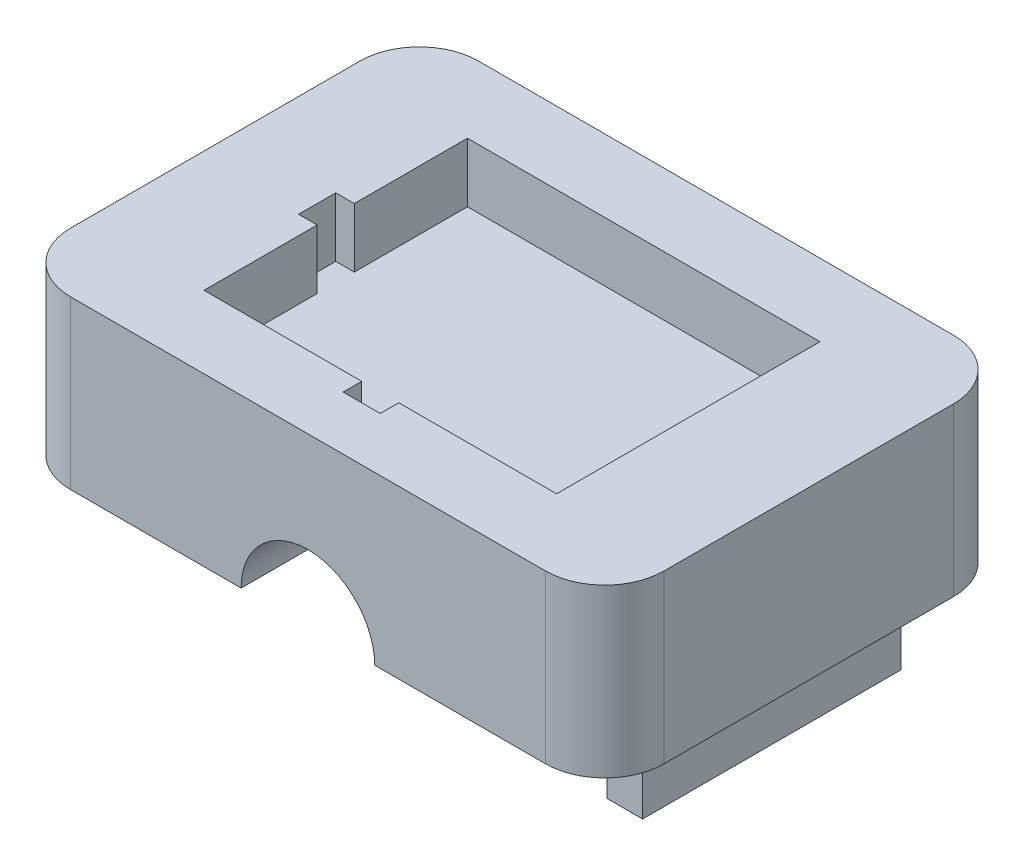
ISO-10303-21;
HEADER;
FILE_DESCRIPTION(('STEP AP214'),'2;1');
FILE_NAME('part.step','',(''),(''),'','','');
FILE_SCHEMA(('AUTOMOTIVE_DESIGN { 1 0 10303 214 1 1 1 1 }'));
ENDSEC;
DATA;
#1=APPLICATION_CONTEXT('core data for automotive mechanical design processes');
#2=APPLICATION_PROTOCOL_DEFINITION('international standard','automotive_design',2000,#1);
#3=PRODUCT_CONTEXT('',#1,'mechanical');
#4=PRODUCT('Part','Part','',(#3));
#5=PRODUCT_RELATED_PRODUCT_CATEGORY('part','',(#4));
#6=PRODUCT_DEFINITION_FORMATION('','',#4);
#7=PRODUCT_DEFINITION_CONTEXT('part definition',#1,'design');
#8=PRODUCT_DEFINITION('design','',#6,#7);
#9=PRODUCT_DEFINITION_SHAPE('','',#8);
#10=(LENGTH_UNIT() NAMED_UNIT(*) SI_UNIT(.MILLI.,.METRE.));
#11=(NAMED_UNIT(*) PLANE_ANGLE_UNIT() SI_UNIT($,.RADIAN.));
#12=(NAMED_UNIT(*) SI_UNIT($,.STERADIAN.) SOLID_ANGLE_UNIT());
#13=UNCERTAINTY_MEASURE_WITH_UNIT(LENGTH_MEASURE(1.E-05),#10,'distance_accuracy_value','');
#14=(GEOMETRIC_REPRESENTATION_CONTEXT(3) GLOBAL_UNCERTAINTY_ASSIGNED_CONTEXT((#13)) GLOBAL_UNIT_ASSIGNED_CONTEXT((#10,
#11,#12)) REPRESENTATION_CONTEXT('',''));
#15=CARTESIAN_POINT('',(0.,0.,0.));
#16=DIRECTION('',(0.,0.,1.));
#17=DIRECTION('',(1.,0.,0.));
#18=AXIS2_PLACEMENT_3D('',#15,#16,#17);
#19=CARTESIAN_POINT('',(0.,0.,55.));
#20=DIRECTION('',(0.,-1.,0.));
#21=DIRECTION('',(1.,0.,0.));
#22=AXIS2_PLACEMENT_3D('',#19,#20,#21);
#23=PLANE('',#22);
#24=DIRECTION('',(-1.,0.,0.));
#25=VECTOR('',#24,1.);
#26=CARTESIAN_POINT('',(0.,0.,0.));
#27=LINE('',#26,#25);
#28=CARTESIAN_POINT('',(32.,0.,0.));
#29=VERTEX_POINT('',#28);
#30=CARTESIAN_POINT('',(9.,0.,0.));
#31=VERTEX_POINT('',#30);
#32=EDGE_CURVE('E530',#29,#31,#27,.T.);
#33=ORIENTED_EDGE('',*,*,#32,.F.);
#34=CARTESIAN_POINT('',(32.,0.,8.));
#35=DIRECTION('',(0.,-1.,0.));
#36=DIRECTION('',(1.,0.,0.));
#37=AXIS2_PLACEMENT_3D('',#34,#35,#36);
#38=CIRCLE('',#37,8.);
#39=CARTESIAN_POINT('',(40.,0.,8.));
#40=VERTEX_POINT('',#39);
#41=EDGE_CURVE('E602',#29,#40,#38,.T.);
#42=ORIENTED_EDGE('',*,*,#41,.T.);
#43=DIRECTION('',(0.,0.,-1.));
#44=VECTOR('',#43,1.);
#45=CARTESIAN_POINT('',(40.,0.,55.));
#46=LINE('',#45,#44);
#47=CARTESIAN_POINT('',(40.,0.,47.));
#48=VERTEX_POINT('',#47);
#49=EDGE_CURVE('E554',#48,#40,#46,.T.);
#50=ORIENTED_EDGE('',*,*,#49,.F.);
#51=CARTESIAN_POINT('',(32.,0.,47.));
#52=DIRECTION('',(0.,-1.,0.));
#53=DIRECTION('',(1.,0.,0.));
#54=AXIS2_PLACEMENT_3D('',#51,#52,#53);
#55=CIRCLE('',#54,8.);
#56=CARTESIAN_POINT('',(32.,0.,55.));
#57=VERTEX_POINT('',#56);
#58=EDGE_CURVE('E599',#48,#57,#55,.T.);
#59=ORIENTED_EDGE('',*,*,#58,.T.);
#60=DIRECTION('',(-1.,0.,0.));
#61=VECTOR('',#60,1.);
#62=CARTESIAN_POINT('',(0.,0.,55.));
#63=LINE('',#62,#61);
#64=CARTESIAN_POINT('',(9.,0.,55.));
#65=VERTEX_POINT('',#64);
#66=EDGE_CURVE('E514',#57,#65,#63,.T.);
#67=ORIENTED_EDGE('',*,*,#66,.T.);
#68=DIRECTION('',(0.,0.,-1.));
#69=VECTOR('',#68,1.);
#70=CARTESIAN_POINT('',(9.,0.,55.));
#71=LINE('',#70,#69);
#72=CARTESIAN_POINT('',(9.,0.,31.55));
#73=VERTEX_POINT('',#72);
#74=EDGE_CURVE('E559',#65,#73,#71,.T.);
#75=ORIENTED_EDGE('',*,*,#74,.T.);
#76=DIRECTION('',(-1.,0.,0.));
#77=VECTOR('',#76,1.);
#78=CARTESIAN_POINT('',(0.,0.,31.55));
#79=LINE('',#78,#77);
#80=CARTESIAN_POINT('',(13.5,0.,31.55));
#81=VERTEX_POINT('',#80);
#82=EDGE_CURVE('E495',#81,#73,#79,.T.);
#83=ORIENTED_EDGE('',*,*,#82,.F.);
#84=DIRECTION('',(0.,0.,1.));
#85=VECTOR('',#84,1.);
#86=CARTESIAN_POINT('',(13.5,0.,23.45));
#87=LINE('',#86,#85);
#88=CARTESIAN_POINT('',(13.5,0.,23.45));
#89=VERTEX_POINT('',#88);
#90=EDGE_CURVE('E506',#89,#81,#87,.T.);
#91=ORIENTED_EDGE('',*,*,#90,.F.);
#92=DIRECTION('',(-1.,0.,0.));
#93=VECTOR('',#92,1.);
#94=CARTESIAN_POINT('',(0.,0.,23.45));
#95=LINE('',#94,#93);
#96=CARTESIAN_POINT('',(9.,0.,23.45));
#97=VERTEX_POINT('',#96);
#98=EDGE_CURVE('E502',#89,#97,#95,.T.);
#99=ORIENTED_EDGE('',*,*,#98,.T.);
#100=EDGE_CURVE('E558',#97,#31,#71,.T.);
#101=ORIENTED_EDGE('',*,*,#100,.T.);
#102=EDGE_LOOP('',(#33,#42,#50,#59,#67,#75,#83,#91,#99,#101));
#103=FACE_BOUND('',#102,.T.);
#104=DIRECTION('',(-1.,0.,0.));
#105=VECTOR('',#104,1.);
#106=CARTESIAN_POINT('',(30.2,0.,44.9));
#107=LINE('',#106,#105);
#108=CARTESIAN_POINT('',(35.,0.,44.9));
#109=VERTEX_POINT('',#108);
#110=CARTESIAN_POINT('',(30.2,0.,44.9));
#111=VERTEX_POINT('',#110);
#112=EDGE_CURVE('E421',#109,#111,#107,.T.);
#113=ORIENTED_EDGE('',*,*,#112,.F.);
#114=DIRECTION('',(0.,0.,1.));
#115=VECTOR('',#114,1.);
#116=CARTESIAN_POINT('',(35.,0.,10.1));
#117=LINE('',#116,#115);
#118=CARTESIAN_POINT('',(35.,0.,10.1));
#119=VERTEX_POINT('',#118);
#120=EDGE_CURVE('E373',#119,#109,#117,.T.);
#121=ORIENTED_EDGE('',*,*,#120,.F.);
#122=DIRECTION('',(1.,0.,0.));
#123=VECTOR('',#122,1.);
#124=CARTESIAN_POINT('',(30.2,0.,10.1));
#125=LINE('',#124,#123);
#126=CARTESIAN_POINT('',(30.2,0.,10.1));
#127=VERTEX_POINT('',#126);
#128=EDGE_CURVE('E408',#127,#119,#125,.T.);
#129=ORIENTED_EDGE('',*,*,#128,.F.);
#130=DIRECTION('',(0.,0.,-1.));
#131=VECTOR('',#130,1.);
#132=CARTESIAN_POINT('',(30.2,0.,10.1));
#133=LINE('',#132,#131);
#134=EDGE_CURVE('E424',#111,#127,#133,.T.);
#135=ORIENTED_EDGE('',*,*,#134,.F.);
#136=EDGE_LOOP('',(#113,#121,#129,#135));
#137=FACE_BOUND('',#136,.T.);
#138=ADVANCED_FACE('F41',(#103,#137),#23,.T.);
#139=CARTESIAN_POINT('',(0.,0.,55.));
#140=DIRECTION('',(0.,-1.,0.));
#141=DIRECTION('',(1.,0.,0.));
#142=AXIS2_PLACEMENT_3D('',#139,#140,#141);
#143=PLANE('',#142);
#144=DIRECTION('',(-1.,0.,0.));
#145=VECTOR('',#144,1.);
#146=CARTESIAN_POINT('',(0.,0.,55.));
#147=LINE('',#146,#145);
#148=CARTESIAN_POINT('',(-9.,0.,55.));
#149=VERTEX_POINT('',#148);
#150=CARTESIAN_POINT('',(-32.,0.,55.));
#151=VERTEX_POINT('',#150);
#152=EDGE_CURVE('E522',#149,#151,#147,.T.);
#153=ORIENTED_EDGE('',*,*,#152,.T.);
#154=CARTESIAN_POINT('',(-32.,0.,47.));
#155=DIRECTION('',(0.,-1.,0.));
#156=DIRECTION('',(1.,0.,0.));
#157=AXIS2_PLACEMENT_3D('',#154,#155,#156);
#158=CIRCLE('',#157,8.);
#159=CARTESIAN_POINT('',(-40.,0.,47.));
#160=VERTEX_POINT('',#159);
#161=EDGE_CURVE('E11',#151,#160,#158,.T.);
#162=ORIENTED_EDGE('',*,*,#161,.T.);
#163=DIRECTION('',(0.,0.,-1.));
#164=VECTOR('',#163,1.);
#165=CARTESIAN_POINT('',(-40.,0.,55.));
#166=LINE('',#165,#164);
#167=CARTESIAN_POINT('',(-40.,0.,8.));
#168=VERTEX_POINT('',#167);
#169=EDGE_CURVE('E544',#160,#168,#166,.T.);
#170=ORIENTED_EDGE('',*,*,#169,.T.);
#171=CARTESIAN_POINT('',(-32.,0.,8.));
#172=DIRECTION('',(0.,-1.,0.));
#173=DIRECTION('',(1.,0.,0.));
#174=AXIS2_PLACEMENT_3D('',#171,#172,#173);
#175=CIRCLE('',#174,8.);
#176=CARTESIAN_POINT('',(-32.,0.,0.));
#177=VERTEX_POINT('',#176);
#178=EDGE_CURVE('E50',#168,#177,#175,.T.);
#179=ORIENTED_EDGE('',*,*,#178,.T.);
#180=DIRECTION('',(-1.,0.,0.));
#181=VECTOR('',#180,1.);
#182=CARTESIAN_POINT('',(0.,0.,0.));
#183=LINE('',#182,#181);
#184=CARTESIAN_POINT('',(-9.,0.,0.));
#185=VERTEX_POINT('',#184);
#186=EDGE_CURVE('E515',#185,#177,#183,.T.);
#187=ORIENTED_EDGE('',*,*,#186,.F.);
#188=DIRECTION('',(0.,0.,-1.));
#189=VECTOR('',#188,1.);
#190=CARTESIAN_POINT('',(-9.,0.,55.));
#191=LINE('',#190,#189);
#192=CARTESIAN_POINT('',(-9.,0.,23.45));
#193=VERTEX_POINT('',#192);
#194=EDGE_CURVE('E526',#193,#185,#191,.T.);
#195=ORIENTED_EDGE('',*,*,#194,.F.);
#196=DIRECTION('',(-1.,0.,0.));
#197=VECTOR('',#196,1.);
#198=CARTESIAN_POINT('',(0.,0.,23.45));
#199=LINE('',#198,#197);
#200=CARTESIAN_POINT('',(-13.5,0.,23.45));
#201=VERTEX_POINT('',#200);
#202=EDGE_CURVE('E569',#193,#201,#199,.T.);
#203=ORIENTED_EDGE('',*,*,#202,.T.);
#204=DIRECTION('',(0.,0.,1.));
#205=VECTOR('',#204,1.);
#206=CARTESIAN_POINT('',(-13.5,0.,23.45));
#207=LINE('',#206,#205);
#208=CARTESIAN_POINT('',(-13.5,0.,31.55));
#209=VERTEX_POINT('',#208);
#210=EDGE_CURVE('E566',#209,#201,#207,.F.);
#211=ORIENTED_EDGE('',*,*,#210,.F.);
#212=DIRECTION('',(-1.,0.,0.));
#213=VECTOR('',#212,1.);
#214=CARTESIAN_POINT('',(0.,0.,31.55));
#215=LINE('',#214,#213);
#216=CARTESIAN_POINT('',(-9.,0.,31.55));
#217=VERTEX_POINT('',#216);
#218=EDGE_CURVE('E563',#217,#209,#215,.T.);
#219=ORIENTED_EDGE('',*,*,#218,.F.);
#220=EDGE_CURVE('E540',#149,#217,#191,.T.);
#221=ORIENTED_EDGE('',*,*,#220,.F.);
#222=EDGE_LOOP('',(#153,#162,#170,#179,#187,#195,#203,#211,#219,#221));
#223=FACE_BOUND('',#222,.T.);
#224=DIRECTION('',(1.,0.,0.));
#225=VECTOR('',#224,1.);
#226=CARTESIAN_POINT('',(-35.,0.,10.1));
#227=LINE('',#226,#225);
#228=CARTESIAN_POINT('',(-35.,0.,10.1));
#229=VERTEX_POINT('',#228);
#230=CARTESIAN_POINT('',(-30.2,0.,10.1));
#231=VERTEX_POINT('',#230);
#232=EDGE_CURVE('E462',#229,#231,#227,.T.);
#233=ORIENTED_EDGE('',*,*,#232,.F.);
#234=DIRECTION('',(0.,0.,-1.));
#235=VECTOR('',#234,1.);
#236=CARTESIAN_POINT('',(-35.,0.,44.9));
#237=LINE('',#236,#235);
#238=CARTESIAN_POINT('',(-35.,0.,44.9));
#239=VERTEX_POINT('',#238);
#240=EDGE_CURVE('E443',#239,#229,#237,.T.);
#241=ORIENTED_EDGE('',*,*,#240,.F.);
#242=DIRECTION('',(-1.,0.,0.));
#243=VECTOR('',#242,1.);
#244=CARTESIAN_POINT('',(-35.,0.,44.9));
#245=LINE('',#244,#243);
#246=CARTESIAN_POINT('',(-30.2,0.,44.9));
#247=VERTEX_POINT('',#246);
#248=EDGE_CURVE('E449',#247,#239,#245,.T.);
#249=ORIENTED_EDGE('',*,*,#248,.F.);
#250=DIRECTION('',(0.,0.,1.));
#251=VECTOR('',#250,1.);
#252=CARTESIAN_POINT('',(-30.2,0.,44.9));
#253=LINE('',#252,#251);
#254=EDGE_CURVE('E465',#231,#247,#253,.T.);
#255=ORIENTED_EDGE('',*,*,#254,.F.);
#256=EDGE_LOOP('',(#233,#241,#249,#255));
#257=FACE_BOUND('',#256,.T.);
#258=ADVANCED_FACE('F621',(#223,#257),#143,.T.);
#259=CARTESIAN_POINT('',(0.,0.,55.));
#260=DIRECTION('',(0.,0.,-1.));
#261=DIRECTION('',(-1.,0.,0.));
#262=AXIS2_PLACEMENT_3D('',#259,#260,#261);
#263=CYLINDRICAL_SURFACE('',#262,9.);
#264=ORIENTED_EDGE('',*,*,#100,.F.);
#265=CARTESIAN_POINT('',(0.,0.,23.45));
#266=DIRECTION('',(0.,0.,1.));
#267=DIRECTION('',(1.,0.,0.));
#268=AXIS2_PLACEMENT_3D('',#265,#266,#267);
#269=CIRCLE('',#268,9.);
#270=EDGE_CURVE('E498',#97,#193,#269,.T.);
#271=ORIENTED_EDGE('',*,*,#270,.T.);
#272=ORIENTED_EDGE('',*,*,#194,.T.);
#273=CARTESIAN_POINT('',(0.,0.,0.));
#274=DIRECTION('',(0.,0.,1.));
#275=DIRECTION('',(1.,0.,0.));
#276=AXIS2_PLACEMENT_3D('',#273,#274,#275);
#277=CIRCLE('',#276,9.);
#278=EDGE_CURVE('E509',#31,#185,#277,.T.);
#279=ORIENTED_EDGE('',*,*,#278,.F.);
#280=EDGE_LOOP('',(#264,#271,#272,#279));
#281=FACE_BOUND('',#280,.T.);
#282=ADVANCED_FACE('F667',(#281),#263,.F.);
#283=CARTESIAN_POINT('',(0.,0.,31.55));
#284=DIRECTION('',(0.,0.,1.));
#285=DIRECTION('',(1.,0.,0.));
#286=AXIS2_PLACEMENT_3D('',#283,#284,#285);
#287=CIRCLE('',#286,9.);
#288=EDGE_CURVE('E489',#73,#217,#287,.T.);
#289=ORIENTED_EDGE('',*,*,#288,.F.);
#290=ORIENTED_EDGE('',*,*,#74,.F.);
#291=CARTESIAN_POINT('',(0.,0.,55.));
#292=DIRECTION('',(0.,0.,1.));
#293=DIRECTION('',(1.,0.,0.));
#294=AXIS2_PLACEMENT_3D('',#291,#292,#293);
#295=CIRCLE('',#294,9.);
#296=EDGE_CURVE('E510',#65,#149,#295,.T.);
#297=ORIENTED_EDGE('',*,*,#296,.T.);
#298=ORIENTED_EDGE('',*,*,#220,.T.);
#299=EDGE_LOOP('',(#289,#290,#297,#298));
#300=FACE_BOUND('',#299,.T.);
#301=ADVANCED_FACE('F683',(#300),#263,.F.);
#302=CARTESIAN_POINT('',(40.,0.,55.));
#303=DIRECTION('',(-1.,0.,0.));
#304=DIRECTION('',(0.,0.,1.));
#305=AXIS2_PLACEMENT_3D('',#302,#303,#304);
#306=PLANE('',#305);
#307=ORIENTED_EDGE('',*,*,#49,.T.);
#308=DIRECTION('',(0.,1.,0.));
#309=VECTOR('',#308,1.);
#310=CARTESIAN_POINT('',(40.,0.,8.));
#311=LINE('',#310,#309);
#312=CARTESIAN_POINT('',(40.,22.5,8.));
#313=VERTEX_POINT('',#312);
#314=EDGE_CURVE('E576',#40,#313,#311,.T.);
#315=ORIENTED_EDGE('',*,*,#314,.T.);
#316=DIRECTION('',(0.,0.,-1.));
#317=VECTOR('',#316,1.);
#318=CARTESIAN_POINT('',(40.,22.5,55.));
#319=LINE('',#318,#317);
#320=CARTESIAN_POINT('',(40.,22.5,47.));
#321=VERTEX_POINT('',#320);
#322=EDGE_CURVE('E550',#321,#313,#319,.T.);
#323=ORIENTED_EDGE('',*,*,#322,.F.);
#324=DIRECTION('',(0.,1.,0.));
#325=VECTOR('',#324,1.);
#326=CARTESIAN_POINT('',(40.,0.,47.));
#327=LINE('',#326,#325);
#328=EDGE_CURVE('E573',#321,#48,#327,.F.);
#329=ORIENTED_EDGE('',*,*,#328,.T.);
#330=EDGE_LOOP('',(#307,#315,#323,#329));
#331=FACE_BOUND('',#330,.T.);
#332=ADVANCED_FACE('F652',(#331),#306,.F.);
#333=CARTESIAN_POINT('',(0.,22.5,55.));
#334=DIRECTION('',(0.,-1.,0.));
#335=DIRECTION('',(1.,0.,0.));
#336=AXIS2_PLACEMENT_3D('',#333,#334,#335);
#337=PLANE('',#336);
#338=DIRECTION('',(-1.,0.,0.));
#339=VECTOR('',#338,1.);
#340=CARTESIAN_POINT('',(-23.75,22.5,9.75000000000001));
#341=LINE('',#340,#339);
#342=CARTESIAN_POINT('',(23.75,22.5,9.75));
#343=VERTEX_POINT('',#342);
#344=CARTESIAN_POINT('',(-23.75,22.5,9.75000000000001));
#345=VERTEX_POINT('',#344);
#346=EDGE_CURVE('E332',#343,#345,#341,.T.);
#347=ORIENTED_EDGE('',*,*,#346,.F.);
#348=DIRECTION('',(0.,0.,-1.));
#349=VECTOR('',#348,1.);
#350=CARTESIAN_POINT('',(23.75,22.5,45.25));
#351=LINE('',#350,#349);
#352=CARTESIAN_POINT('',(23.75,22.5,45.25));
#353=VERTEX_POINT('',#352);
#354=EDGE_CURVE('E57',#353,#343,#351,.T.);
#355=ORIENTED_EDGE('',*,*,#354,.F.);
#356=DIRECTION('',(1.,0.,0.));
#357=VECTOR('',#356,1.);
#358=CARTESIAN_POINT('',(2.5,22.5,45.25));
#359=LINE('',#358,#357);
#360=CARTESIAN_POINT('',(2.5,22.5,45.25));
#361=VERTEX_POINT('',#360);
#362=EDGE_CURVE('E288',#361,#353,#359,.T.);
#363=ORIENTED_EDGE('',*,*,#362,.F.);
#364=DIRECTION('',(0.,0.,-1.));
#365=VECTOR('',#364,1.);
#366=CARTESIAN_POINT('',(2.5,22.5,47.75));
#367=LINE('',#366,#365);
#368=CARTESIAN_POINT('',(2.5,22.5,47.75));
#369=VERTEX_POINT('',#368);
#370=EDGE_CURVE('E292',#369,#361,#367,.T.);
#371=ORIENTED_EDGE('',*,*,#370,.F.);
#372=DIRECTION('',(1.,0.,0.));
#373=VECTOR('',#372,1.);
#374=CARTESIAN_POINT('',(-2.5,22.5,47.75));
#375=LINE('',#374,#373);
#376=CARTESIAN_POINT('',(-2.5,22.5,47.75));
#377=VERTEX_POINT('',#376);
#378=EDGE_CURVE('E363',#377,#369,#375,.T.);
#379=ORIENTED_EDGE('',*,*,#378,.F.);
#380=DIRECTION('',(0.,0.,1.));
#381=VECTOR('',#380,1.);
#382=CARTESIAN_POINT('',(-2.5,22.5,45.25));
#383=LINE('',#382,#381);
#384=CARTESIAN_POINT('',(-2.5,22.5,45.25));
#385=VERTEX_POINT('',#384);
#386=EDGE_CURVE('E359',#385,#377,#383,.T.);
#387=ORIENTED_EDGE('',*,*,#386,.F.);
#388=DIRECTION('',(1.,0.,0.));
#389=VECTOR('',#388,1.);
#390=CARTESIAN_POINT('',(-23.75,22.5,45.25));
#391=LINE('',#390,#389);
#392=CARTESIAN_POINT('',(-23.75,22.5,45.25));
#393=VERTEX_POINT('',#392);
#394=EDGE_CURVE('E355',#393,#385,#391,.T.);
#395=ORIENTED_EDGE('',*,*,#394,.F.);
#396=DIRECTION('',(0.,0.,1.));
#397=VECTOR('',#396,1.);
#398=CARTESIAN_POINT('',(-23.75,22.5,45.25));
#399=LINE('',#398,#397);
#400=CARTESIAN_POINT('',(-23.75,22.5,30.));
#401=VERTEX_POINT('',#400);
#402=EDGE_CURVE('E351',#401,#393,#399,.T.);
#403=ORIENTED_EDGE('',*,*,#402,.F.);
#404=DIRECTION('',(1.,0.,0.));
#405=VECTOR('',#404,1.);
#406=CARTESIAN_POINT('',(-26.25,22.5,30.));
#407=LINE('',#406,#405);
#408=CARTESIAN_POINT('',(-26.25,22.5,30.));
#409=VERTEX_POINT('',#408);
#410=EDGE_CURVE('E347',#409,#401,#407,.T.);
#411=ORIENTED_EDGE('',*,*,#410,.F.);
#412=DIRECTION('',(0.,0.,1.));
#413=VECTOR('',#412,1.);
#414=CARTESIAN_POINT('',(-26.25,22.5,25.));
#415=LINE('',#414,#413);
#416=CARTESIAN_POINT('',(-26.25,22.5,25.));
#417=VERTEX_POINT('',#416);
#418=EDGE_CURVE('E343',#417,#409,#415,.T.);
#419=ORIENTED_EDGE('',*,*,#418,.F.);
#420=DIRECTION('',(-1.,0.,0.));
#421=VECTOR('',#420,1.);
#422=CARTESIAN_POINT('',(-23.75,22.5,25.));
#423=LINE('',#422,#421);
#424=CARTESIAN_POINT('',(-23.75,22.5,25.));
#425=VERTEX_POINT('',#424);
#426=EDGE_CURVE('E339',#425,#417,#423,.T.);
#427=ORIENTED_EDGE('',*,*,#426,.F.);
#428=DIRECTION('',(0.,0.,1.));
#429=VECTOR('',#428,1.);
#430=CARTESIAN_POINT('',(-23.75,22.5,25.));
#431=LINE('',#430,#429);
#432=EDGE_CURVE('E335',#345,#425,#431,.T.);
#433=ORIENTED_EDGE('',*,*,#432,.F.);
#434=EDGE_LOOP('',(#347,#355,#363,#371,#379,#387,#395,#403,#411,#419,#427,#433));
#435=FACE_BOUND('',#434,.T.);
#436=ORIENTED_EDGE('',*,*,#322,.T.);
#437=CARTESIAN_POINT('',(32.,22.5,8.));
#438=DIRECTION('',(0.,-1.,0.));
#439=DIRECTION('',(1.,0.,0.));
#440=AXIS2_PLACEMENT_3D('',#437,#438,#439);
#441=CIRCLE('',#440,8.);
#442=CARTESIAN_POINT('',(32.,22.5,0.));
#443=VERTEX_POINT('',#442);
#444=EDGE_CURVE('E589',#313,#443,#441,.F.);
#445=ORIENTED_EDGE('',*,*,#444,.T.);
#446=DIRECTION('',(-1.,0.,0.));
#447=VECTOR('',#446,1.);
#448=CARTESIAN_POINT('',(0.,22.5,0.));
#449=LINE('',#448,#447);
#450=CARTESIAN_POINT('',(-32.,22.5,0.));
#451=VERTEX_POINT('',#450);
#452=EDGE_CURVE('E533',#443,#451,#449,.T.);
#453=ORIENTED_EDGE('',*,*,#452,.T.);
#454=CARTESIAN_POINT('',(-32.,22.5,8.));
#455=DIRECTION('',(0.,-1.,0.));
#456=DIRECTION('',(1.,0.,0.));
#457=AXIS2_PLACEMENT_3D('',#454,#455,#456);
#458=CIRCLE('',#457,8.);
#459=CARTESIAN_POINT('',(-40.,22.5,8.));
#460=VERTEX_POINT('',#459);
#461=EDGE_CURVE('E580',#451,#460,#458,.F.);
#462=ORIENTED_EDGE('',*,*,#461,.T.);
#463=DIRECTION('',(0.,0.,-1.));
#464=VECTOR('',#463,1.);
#465=CARTESIAN_POINT('',(-40.,22.5,55.));
#466=LINE('',#465,#464);
#467=CARTESIAN_POINT('',(-40.,22.5,47.));
#468=VERTEX_POINT('',#467);
#469=EDGE_CURVE('E547',#468,#460,#466,.T.);
#470=ORIENTED_EDGE('',*,*,#469,.F.);
#471=CARTESIAN_POINT('',(-32.,22.5,47.));
#472=DIRECTION('',(0.,-1.,0.));
#473=DIRECTION('',(1.,0.,0.));
#474=AXIS2_PLACEMENT_3D('',#471,#472,#473);
#475=CIRCLE('',#474,8.);
#476=CARTESIAN_POINT('',(-32.,22.5,55.));
#477=VERTEX_POINT('',#476);
#478=EDGE_CURVE('E583',#468,#477,#475,.F.);
#479=ORIENTED_EDGE('',*,*,#478,.T.);
#480=DIRECTION('',(-1.,0.,0.));
#481=VECTOR('',#480,1.);
#482=CARTESIAN_POINT('',(0.,22.5,55.));
#483=LINE('',#482,#481);
#484=CARTESIAN_POINT('',(32.,22.5,55.));
#485=VERTEX_POINT('',#484);
#486=EDGE_CURVE('E518',#485,#477,#483,.T.);
#487=ORIENTED_EDGE('',*,*,#486,.F.);
#488=CARTESIAN_POINT('',(32.,22.5,47.));
#489=DIRECTION('',(0.,-1.,0.));
#490=DIRECTION('',(1.,0.,0.));
#491=AXIS2_PLACEMENT_3D('',#488,#489,#490);
#492=CIRCLE('',#491,8.);
#493=EDGE_CURVE('E586',#485,#321,#492,.F.);
#494=ORIENTED_EDGE('',*,*,#493,.T.);
#495=EDGE_LOOP('',(#436,#445,#453,#462,#470,#479,#487,#494));
#496=FACE_BOUND('',#495,.T.);
#497=ADVANCED_FACE('F632',(#435,#496),#337,.F.);
#498=CARTESIAN_POINT('',(-40.,0.,55.));
#499=DIRECTION('',(-1.,0.,0.));
#500=DIRECTION('',(0.,-1.,0.));
#501=AXIS2_PLACEMENT_3D('',#498,#499,#500);
#502=PLANE('',#501);
#503=ORIENTED_EDGE('',*,*,#169,.F.);
#504=DIRECTION('',(0.,1.,0.));
#505=VECTOR('',#504,1.);
#506=CARTESIAN_POINT('',(-40.,0.,47.));
#507=LINE('',#506,#505);
#508=EDGE_CURVE('E614',#160,#468,#507,.T.);
#509=ORIENTED_EDGE('',*,*,#508,.T.);
#510=ORIENTED_EDGE('',*,*,#469,.T.);
#511=DIRECTION('',(0.,1.,0.));
#512=VECTOR('',#511,1.);
#513=CARTESIAN_POINT('',(-40.,0.,8.));
#514=LINE('',#513,#512);
#515=EDGE_CURVE('E65',#460,#168,#514,.F.);
#516=ORIENTED_EDGE('',*,*,#515,.T.);
#517=EDGE_LOOP('',(#503,#509,#510,#516));
#518=FACE_BOUND('',#517,.T.);
#519=ADVANCED_FACE('F633',(#518),#502,.T.);
#520=CARTESIAN_POINT('',(0.,0.,55.));
#521=DIRECTION('',(0.,0.,1.));
#522=DIRECTION('',(1.,0.,0.));
#523=AXIS2_PLACEMENT_3D('',#520,#521,#522);
#524=PLANE('',#523);
#525=ORIENTED_EDGE('',*,*,#66,.F.);
#526=DIRECTION('',(0.,1.,0.));
#527=VECTOR('',#526,1.);
#528=CARTESIAN_POINT('',(32.,22.5,55.));
#529=LINE('',#528,#527);
#530=EDGE_CURVE('E608',#57,#485,#529,.T.);
#531=ORIENTED_EDGE('',*,*,#530,.T.);
#532=ORIENTED_EDGE('',*,*,#486,.T.);
#533=DIRECTION('',(0.,1.,0.));
#534=VECTOR('',#533,1.);
#535=CARTESIAN_POINT('',(-32.,0.,55.));
#536=LINE('',#535,#534);
#537=EDGE_CURVE('E605',#477,#151,#536,.F.);
#538=ORIENTED_EDGE('',*,*,#537,.T.);
#539=ORIENTED_EDGE('',*,*,#152,.F.);
#540=ORIENTED_EDGE('',*,*,#296,.F.);
#541=EDGE_LOOP('',(#525,#531,#532,#538,#539,#540));
#542=FACE_BOUND('',#541,.T.);
#543=ADVANCED_FACE('F642',(#542),#524,.T.);
#544=CARTESIAN_POINT('',(0.,0.,0.));
#545=DIRECTION('',(0.,0.,1.));
#546=DIRECTION('',(1.,0.,0.));
#547=AXIS2_PLACEMENT_3D('',#544,#545,#546);
#548=PLANE('',#547);
#549=ORIENTED_EDGE('',*,*,#452,.F.);
#550=DIRECTION('',(0.,1.,0.));
#551=VECTOR('',#550,1.);
#552=CARTESIAN_POINT('',(32.,0.,0.));
#553=LINE('',#552,#551);
#554=EDGE_CURVE('E596',#443,#29,#553,.F.);
#555=ORIENTED_EDGE('',*,*,#554,.T.);
#556=ORIENTED_EDGE('',*,*,#32,.T.);
#557=ORIENTED_EDGE('',*,*,#278,.T.);
#558=ORIENTED_EDGE('',*,*,#186,.T.);
#559=DIRECTION('',(0.,1.,0.));
#560=VECTOR('',#559,1.);
#561=CARTESIAN_POINT('',(-32.,22.5,0.));
#562=LINE('',#561,#560);
#563=EDGE_CURVE('E592',#177,#451,#562,.T.);
#564=ORIENTED_EDGE('',*,*,#563,.T.);
#565=EDGE_LOOP('',(#549,#555,#556,#557,#558,#564));
#566=FACE_BOUND('',#565,.T.);
#567=ADVANCED_FACE('F628',(#566),#548,.F.);
#568=CARTESIAN_POINT('',(0.,0.,23.45));
#569=DIRECTION('',(0.,0.,1.));
#570=DIRECTION('',(1.,0.,0.));
#571=AXIS2_PLACEMENT_3D('',#568,#569,#570);
#572=CYLINDRICAL_SURFACE('',#571,13.5);
#573=ORIENTED_EDGE('',*,*,#90,.T.);
#574=CARTESIAN_POINT('',(0.,0.,31.55));
#575=DIRECTION('',(0.,0.,1.));
#576=DIRECTION('',(1.,0.,0.));
#577=AXIS2_PLACEMENT_3D('',#574,#575,#576);
#578=CIRCLE('',#577,13.5);
#579=EDGE_CURVE('E484',#81,#209,#578,.T.);
#580=ORIENTED_EDGE('',*,*,#579,.T.);
#581=ORIENTED_EDGE('',*,*,#210,.T.);
#582=CARTESIAN_POINT('',(0.,0.,23.45));
#583=DIRECTION('',(0.,0.,1.));
#584=DIRECTION('',(1.,0.,0.));
#585=AXIS2_PLACEMENT_3D('',#582,#583,#584);
#586=CIRCLE('',#585,13.5);
#587=EDGE_CURVE('E485',#89,#201,#586,.T.);
#588=ORIENTED_EDGE('',*,*,#587,.F.);
#589=EDGE_LOOP('',(#573,#580,#581,#588));
#590=FACE_BOUND('',#589,.T.);
#591=ADVANCED_FACE('F675',(#590),#572,.F.);
#592=CARTESIAN_POINT('',(0.,0.,23.45));
#593=DIRECTION('',(0.,0.,1.));
#594=DIRECTION('',(1.,0.,0.));
#595=AXIS2_PLACEMENT_3D('',#592,#593,#594);
#596=PLANE('',#595);
#597=ORIENTED_EDGE('',*,*,#587,.T.);
#598=ORIENTED_EDGE('',*,*,#202,.F.);
#599=ORIENTED_EDGE('',*,*,#270,.F.);
#600=ORIENTED_EDGE('',*,*,#98,.F.);
#601=EDGE_LOOP('',(#597,#598,#599,#600));
#602=FACE_BOUND('',#601,.T.);
#603=ADVANCED_FACE('F672',(#602),#596,.T.);
#604=CARTESIAN_POINT('',(0.,0.,31.55));
#605=DIRECTION('',(0.,0.,1.));
#606=DIRECTION('',(1.,0.,0.));
#607=AXIS2_PLACEMENT_3D('',#604,#605,#606);
#608=PLANE('',#607);
#609=ORIENTED_EDGE('',*,*,#82,.T.);
#610=ORIENTED_EDGE('',*,*,#288,.T.);
#611=ORIENTED_EDGE('',*,*,#218,.T.);
#612=ORIENTED_EDGE('',*,*,#579,.F.);
#613=EDGE_LOOP('',(#609,#610,#611,#612));
#614=FACE_BOUND('',#613,.T.);
#615=ADVANCED_FACE('F681',(#614),#608,.F.);
#616=CARTESIAN_POINT('',(-35.,-10.,44.9));
#617=DIRECTION('',(1.,0.,0.));
#618=DIRECTION('',(0.,0.,-1.));
#619=AXIS2_PLACEMENT_3D('',#616,#617,#618);
#620=PLANE('',#619);
#621=ORIENTED_EDGE('',*,*,#240,.T.);
#622=DIRECTION('',(0.,1.,0.));
#623=VECTOR('',#622,1.);
#624=CARTESIAN_POINT('',(-35.,-10.,10.1));
#625=LINE('',#624,#623);
#626=CARTESIAN_POINT('',(-35.,-10.,10.1));
#627=VERTEX_POINT('',#626);
#628=EDGE_CURVE('E481',#627,#229,#625,.T.);
#629=ORIENTED_EDGE('',*,*,#628,.F.);
#630=DIRECTION('',(0.,0.,-1.));
#631=VECTOR('',#630,1.);
#632=CARTESIAN_POINT('',(-35.,-10.,44.9));
#633=LINE('',#632,#631);
#634=CARTESIAN_POINT('',(-35.,-10.,44.9));
#635=VERTEX_POINT('',#634);
#636=EDGE_CURVE('E444',#635,#627,#633,.T.);
#637=ORIENTED_EDGE('',*,*,#636,.F.);
#638=DIRECTION('',(0.,1.,0.));
#639=VECTOR('',#638,1.);
#640=CARTESIAN_POINT('',(-35.,-10.,44.9));
#641=LINE('',#640,#639);
#642=EDGE_CURVE('E458',#635,#239,#641,.T.);
#643=ORIENTED_EDGE('',*,*,#642,.T.);
#644=EDGE_LOOP('',(#621,#629,#637,#643));
#645=FACE_BOUND('',#644,.T.);
#646=ADVANCED_FACE('F712',(#645),#620,.F.);
#647=CARTESIAN_POINT('',(-35.,-10.,10.1));
#648=DIRECTION('',(0.,0.,1.));
#649=DIRECTION('',(1.,0.,0.));
#650=AXIS2_PLACEMENT_3D('',#647,#648,#649);
#651=PLANE('',#650);
#652=ORIENTED_EDGE('',*,*,#232,.T.);
#653=DIRECTION('',(0.,1.,0.));
#654=VECTOR('',#653,1.);
#655=CARTESIAN_POINT('',(-30.2,-10.,10.1));
#656=LINE('',#655,#654);
#657=CARTESIAN_POINT('',(-30.2,-10.,10.1));
#658=VERTEX_POINT('',#657);
#659=EDGE_CURVE('E477',#658,#231,#656,.T.);
#660=ORIENTED_EDGE('',*,*,#659,.F.);
#661=DIRECTION('',(1.,0.,0.));
#662=VECTOR('',#661,1.);
#663=CARTESIAN_POINT('',(-35.,-10.,10.1));
#664=LINE('',#663,#662);
#665=EDGE_CURVE('E448',#627,#658,#664,.T.);
#666=ORIENTED_EDGE('',*,*,#665,.F.);
#667=ORIENTED_EDGE('',*,*,#628,.T.);
#668=EDGE_LOOP('',(#652,#660,#666,#667));
#669=FACE_BOUND('',#668,.T.);
#670=ADVANCED_FACE('F717',(#669),#651,.F.);
#671=CARTESIAN_POINT('',(-30.2,-10.,44.9));
#672=DIRECTION('',(-1.,0.,0.));
#673=DIRECTION('',(0.,0.,1.));
#674=AXIS2_PLACEMENT_3D('',#671,#672,#673);
#675=PLANE('',#674);
#676=ORIENTED_EDGE('',*,*,#254,.T.);
#677=DIRECTION('',(0.,1.,0.));
#678=VECTOR('',#677,1.);
#679=CARTESIAN_POINT('',(-30.2,-10.,44.9));
#680=LINE('',#679,#678);
#681=CARTESIAN_POINT('',(-30.2,-10.,44.9));
#682=VERTEX_POINT('',#681);
#683=EDGE_CURVE('E474',#682,#247,#680,.T.);
#684=ORIENTED_EDGE('',*,*,#683,.F.);
#685=DIRECTION('',(0.,0.,1.));
#686=VECTOR('',#685,1.);
#687=CARTESIAN_POINT('',(-30.2,-10.,44.9));
#688=LINE('',#687,#686);
#689=EDGE_CURVE('E452',#658,#682,#688,.T.);
#690=ORIENTED_EDGE('',*,*,#689,.F.);
#691=ORIENTED_EDGE('',*,*,#659,.T.);
#692=EDGE_LOOP('',(#676,#684,#690,#691));
#693=FACE_BOUND('',#692,.T.);
#694=ADVANCED_FACE('F721',(#693),#675,.F.);
#695=CARTESIAN_POINT('',(-35.,-10.,44.9));
#696=DIRECTION('',(0.,0.,-1.));
#697=DIRECTION('',(-1.,0.,0.));
#698=AXIS2_PLACEMENT_3D('',#695,#696,#697);
#699=PLANE('',#698);
#700=ORIENTED_EDGE('',*,*,#248,.T.);
#701=ORIENTED_EDGE('',*,*,#642,.F.);
#702=DIRECTION('',(-1.,0.,0.));
#703=VECTOR('',#702,1.);
#704=CARTESIAN_POINT('',(-35.,-10.,44.9));
#705=LINE('',#704,#703);
#706=EDGE_CURVE('E455',#682,#635,#705,.T.);
#707=ORIENTED_EDGE('',*,*,#706,.F.);
#708=ORIENTED_EDGE('',*,*,#683,.T.);
#709=EDGE_LOOP('',(#700,#701,#707,#708));
#710=FACE_BOUND('',#709,.T.);
#711=ADVANCED_FACE('F725',(#710),#699,.F.);
#712=CARTESIAN_POINT('',(0.,-10.,0.));
#713=DIRECTION('',(0.,-1.,0.));
#714=DIRECTION('',(1.,0.,0.));
#715=AXIS2_PLACEMENT_3D('',#712,#713,#714);
#716=PLANE('',#715);
#717=ORIENTED_EDGE('',*,*,#636,.T.);
#718=ORIENTED_EDGE('',*,*,#665,.T.);
#719=ORIENTED_EDGE('',*,*,#689,.T.);
#720=ORIENTED_EDGE('',*,*,#706,.T.);
#721=EDGE_LOOP('',(#717,#718,#719,#720));
#722=FACE_BOUND('',#721,.T.);
#723=ADVANCED_FACE('F729',(#722),#716,.T.);
#724=CARTESIAN_POINT('',(35.,-10.,10.1));
#725=DIRECTION('',(-1.,0.,0.));
#726=DIRECTION('',(0.,-1.,0.));
#727=AXIS2_PLACEMENT_3D('',#724,#725,#726);
#728=PLANE('',#727);
#729=ORIENTED_EDGE('',*,*,#120,.T.);
#730=DIRECTION('',(0.,1.,0.));
#731=VECTOR('',#730,1.);
#732=CARTESIAN_POINT('',(35.,-10.,44.9));
#733=LINE('',#732,#731);
#734=CARTESIAN_POINT('',(35.,-10.,44.9));
#735=VERTEX_POINT('',#734);
#736=EDGE_CURVE('E440',#735,#109,#733,.T.);
#737=ORIENTED_EDGE('',*,*,#736,.F.);
#738=DIRECTION('',(0.,0.,1.));
#739=VECTOR('',#738,1.);
#740=CARTESIAN_POINT('',(35.,-10.,10.1));
#741=LINE('',#740,#739);
#742=CARTESIAN_POINT('',(35.,-10.,10.1));
#743=VERTEX_POINT('',#742);
#744=EDGE_CURVE('E403',#743,#735,#741,.T.);
#745=ORIENTED_EDGE('',*,*,#744,.F.);
#746=DIRECTION('',(0.,1.,0.));
#747=VECTOR('',#746,1.);
#748=CARTESIAN_POINT('',(35.,-10.,10.1));
#749=LINE('',#748,#747);
#750=EDGE_CURVE('E417',#743,#119,#749,.T.);
#751=ORIENTED_EDGE('',*,*,#750,.T.);
#752=EDGE_LOOP('',(#729,#737,#745,#751));
#753=FACE_BOUND('',#752,.T.);
#754=ADVANCED_FACE('F733',(#753),#728,.F.);
#755=CARTESIAN_POINT('',(30.2,-10.,44.9));
#756=DIRECTION('',(0.,0.,-1.));
#757=DIRECTION('',(-1.,0.,0.));
#758=AXIS2_PLACEMENT_3D('',#755,#756,#757);
#759=PLANE('',#758);
#760=ORIENTED_EDGE('',*,*,#112,.T.);
#761=DIRECTION('',(0.,1.,0.));
#762=VECTOR('',#761,1.);
#763=CARTESIAN_POINT('',(30.2,-10.,44.9));
#764=LINE('',#763,#762);
#765=CARTESIAN_POINT('',(30.2,-10.,44.9));
#766=VERTEX_POINT('',#765);
#767=EDGE_CURVE('E436',#766,#111,#764,.T.);
#768=ORIENTED_EDGE('',*,*,#767,.F.);
#769=DIRECTION('',(-1.,0.,0.));
#770=VECTOR('',#769,1.);
#771=CARTESIAN_POINT('',(30.2,-10.,44.9));
#772=LINE('',#771,#770);
#773=EDGE_CURVE('E407',#735,#766,#772,.T.);
#774=ORIENTED_EDGE('',*,*,#773,.F.);
#775=ORIENTED_EDGE('',*,*,#736,.T.);
#776=EDGE_LOOP('',(#760,#768,#774,#775));
#777=FACE_BOUND('',#776,.T.);
#778=ADVANCED_FACE('F737',(#777),#759,.F.);
#779=CARTESIAN_POINT('',(30.2,-10.,10.1));
#780=DIRECTION('',(1.,0.,0.));
#781=DIRECTION('',(0.,1.,0.));
#782=AXIS2_PLACEMENT_3D('',#779,#780,#781);
#783=PLANE('',#782);
#784=ORIENTED_EDGE('',*,*,#134,.T.);
#785=DIRECTION('',(0.,1.,0.));
#786=VECTOR('',#785,1.);
#787=CARTESIAN_POINT('',(30.2,-10.,10.1));
#788=LINE('',#787,#786);
#789=CARTESIAN_POINT('',(30.2,-10.,10.1));
#790=VERTEX_POINT('',#789);
#791=EDGE_CURVE('E433',#790,#127,#788,.T.);
#792=ORIENTED_EDGE('',*,*,#791,.F.);
#793=DIRECTION('',(0.,0.,-1.));
#794=VECTOR('',#793,1.);
#795=CARTESIAN_POINT('',(30.2,-10.,10.1));
#796=LINE('',#795,#794);
#797=EDGE_CURVE('E411',#766,#790,#796,.T.);
#798=ORIENTED_EDGE('',*,*,#797,.F.);
#799=ORIENTED_EDGE('',*,*,#767,.T.);
#800=EDGE_LOOP('',(#784,#792,#798,#799));
#801=FACE_BOUND('',#800,.T.);
#802=ADVANCED_FACE('F741',(#801),#783,.F.);
#803=CARTESIAN_POINT('',(30.2,-10.,10.1));
#804=DIRECTION('',(0.,0.,1.));
#805=DIRECTION('',(1.,0.,0.));
#806=AXIS2_PLACEMENT_3D('',#803,#804,#805);
#807=PLANE('',#806);
#808=ORIENTED_EDGE('',*,*,#128,.T.);
#809=ORIENTED_EDGE('',*,*,#750,.F.);
#810=DIRECTION('',(1.,0.,0.));
#811=VECTOR('',#810,1.);
#812=CARTESIAN_POINT('',(30.2,-10.,10.1));
#813=LINE('',#812,#811);
#814=EDGE_CURVE('E414',#790,#743,#813,.T.);
#815=ORIENTED_EDGE('',*,*,#814,.F.);
#816=ORIENTED_EDGE('',*,*,#791,.T.);
#817=EDGE_LOOP('',(#808,#809,#815,#816));
#818=FACE_BOUND('',#817,.T.);
#819=ADVANCED_FACE('F745',(#818),#807,.F.);
#820=CARTESIAN_POINT('',(0.,-10.,0.));
#821=DIRECTION('',(0.,1.,0.));
#822=DIRECTION('',(-1.,0.,0.));
#823=AXIS2_PLACEMENT_3D('',#820,#821,#822);
#824=PLANE('',#823);
#825=ORIENTED_EDGE('',*,*,#744,.T.);
#826=ORIENTED_EDGE('',*,*,#773,.T.);
#827=ORIENTED_EDGE('',*,*,#797,.T.);
#828=ORIENTED_EDGE('',*,*,#814,.T.);
#829=EDGE_LOOP('',(#825,#826,#827,#828));
#830=FACE_BOUND('',#829,.T.);
#831=ADVANCED_FACE('F749',(#830),#824,.F.);
#832=CARTESIAN_POINT('',(32.,0.,8.));
#833=DIRECTION('',(0.,1.,0.));
#834=DIRECTION('',(0.,0.,1.));
#835=AXIS2_PLACEMENT_3D('',#832,#833,#834);
#836=CYLINDRICAL_SURFACE('',#835,8.);
#837=ORIENTED_EDGE('',*,*,#41,.F.);
#838=ORIENTED_EDGE('',*,*,#554,.F.);
#839=ORIENTED_EDGE('',*,*,#444,.F.);
#840=ORIENTED_EDGE('',*,*,#314,.F.);
#841=EDGE_LOOP('',(#837,#838,#839,#840));
#842=FACE_BOUND('',#841,.T.);
#843=ADVANCED_FACE('F657',(#842),#836,.T.);
#844=CARTESIAN_POINT('',(32.,0.,47.));
#845=DIRECTION('',(0.,-1.,0.));
#846=DIRECTION('',(0.,0.,-1.));
#847=AXIS2_PLACEMENT_3D('',#844,#845,#846);
#848=CYLINDRICAL_SURFACE('',#847,8.);
#849=ORIENTED_EDGE('',*,*,#58,.F.);
#850=ORIENTED_EDGE('',*,*,#328,.F.);
#851=ORIENTED_EDGE('',*,*,#493,.F.);
#852=ORIENTED_EDGE('',*,*,#530,.F.);
#853=EDGE_LOOP('',(#849,#850,#851,#852));
#854=FACE_BOUND('',#853,.T.);
#855=ADVANCED_FACE('F648',(#854),#848,.T.);
#856=CARTESIAN_POINT('',(-32.,0.,47.));
#857=DIRECTION('',(0.,1.,0.));
#858=DIRECTION('',(-1.,0.,0.));
#859=AXIS2_PLACEMENT_3D('',#856,#857,#858);
#860=CYLINDRICAL_SURFACE('',#859,8.);
#861=ORIENTED_EDGE('',*,*,#161,.F.);
#862=ORIENTED_EDGE('',*,*,#537,.F.);
#863=ORIENTED_EDGE('',*,*,#478,.F.);
#864=ORIENTED_EDGE('',*,*,#508,.F.);
#865=EDGE_LOOP('',(#861,#862,#863,#864));
#866=FACE_BOUND('',#865,.T.);
#867=ADVANCED_FACE('F637',(#866),#860,.T.);
#868=CARTESIAN_POINT('',(-32.,0.,8.));
#869=DIRECTION('',(0.,-1.,0.));
#870=DIRECTION('',(1.,0.,0.));
#871=AXIS2_PLACEMENT_3D('',#868,#869,#870);
#872=CYLINDRICAL_SURFACE('',#871,8.);
#873=ORIENTED_EDGE('',*,*,#178,.F.);
#874=ORIENTED_EDGE('',*,*,#515,.F.);
#875=ORIENTED_EDGE('',*,*,#461,.F.);
#876=ORIENTED_EDGE('',*,*,#563,.F.);
#877=EDGE_LOOP('',(#873,#874,#875,#876));
#878=FACE_BOUND('',#877,.T.);
#879=ADVANCED_FACE('F43',(#878),#872,.T.);
#880=CARTESIAN_POINT('',(23.75,14.5,45.25));
#881=DIRECTION('',(1.,0.,0.));
#882=DIRECTION('',(0.,1.,0.));
#883=AXIS2_PLACEMENT_3D('',#880,#881,#882);
#884=PLANE('',#883);
#885=ORIENTED_EDGE('',*,*,#354,.T.);
#886=DIRECTION('',(0.,1.,0.));
#887=VECTOR('',#886,1.);
#888=CARTESIAN_POINT('',(23.75,14.5,9.75000000000001));
#889=LINE('',#888,#887);
#890=CARTESIAN_POINT('',(23.75,14.5,9.75000000000001));
#891=VERTEX_POINT('',#890);
#892=EDGE_CURVE('E262',#891,#343,#889,.T.);
#893=ORIENTED_EDGE('',*,*,#892,.F.);
#894=DIRECTION('',(0.,0.,-1.));
#895=VECTOR('',#894,1.);
#896=CARTESIAN_POINT('',(23.75,14.5,45.25));
#897=LINE('',#896,#895);
#898=CARTESIAN_POINT('',(23.75,14.5,45.25));
#899=VERTEX_POINT('',#898);
#900=EDGE_CURVE('E266',#899,#891,#897,.T.);
#901=ORIENTED_EDGE('',*,*,#900,.F.);
#902=DIRECTION('',(0.,1.,0.));
#903=VECTOR('',#902,1.);
#904=CARTESIAN_POINT('',(23.75,14.5,45.25));
#905=LINE('',#904,#903);
#906=EDGE_CURVE('E370',#899,#353,#905,.T.);
#907=ORIENTED_EDGE('',*,*,#906,.T.);
#908=EDGE_LOOP('',(#885,#893,#901,#907));
#909=FACE_BOUND('',#908,.T.);
#910=ADVANCED_FACE('F264',(#909),#884,.F.);
#911=CARTESIAN_POINT('',(2.5,14.5,45.25));
#912=DIRECTION('',(0.,0.,1.));
#913=DIRECTION('',(1.,0.,0.));
#914=AXIS2_PLACEMENT_3D('',#911,#912,#913);
#915=PLANE('',#914);
#916=ORIENTED_EDGE('',*,*,#362,.T.);
#917=ORIENTED_EDGE('',*,*,#906,.F.);
#918=DIRECTION('',(1.,0.,0.));
#919=VECTOR('',#918,1.);
#920=CARTESIAN_POINT('',(2.5,14.5,45.25));
#921=LINE('',#920,#919);
#922=CARTESIAN_POINT('',(2.5,14.5,45.25));
#923=VERTEX_POINT('',#922);
#924=EDGE_CURVE('E273',#923,#899,#921,.T.);
#925=ORIENTED_EDGE('',*,*,#924,.F.);
#926=DIRECTION('',(0.,1.,0.));
#927=VECTOR('',#926,1.);
#928=CARTESIAN_POINT('',(2.5,14.5,45.25));
#929=LINE('',#928,#927);
#930=EDGE_CURVE('E374',#923,#361,#929,.T.);
#931=ORIENTED_EDGE('',*,*,#930,.T.);
#932=EDGE_LOOP('',(#916,#917,#925,#931));
#933=FACE_BOUND('',#932,.T.);
#934=ADVANCED_FACE('F756',(#933),#915,.F.);
#935=CARTESIAN_POINT('',(2.5,14.5,47.75));
#936=DIRECTION('',(1.,0.,0.));
#937=DIRECTION('',(0.,1.,0.));
#938=AXIS2_PLACEMENT_3D('',#935,#936,#937);
#939=PLANE('',#938);
#940=ORIENTED_EDGE('',*,*,#370,.T.);
#941=ORIENTED_EDGE('',*,*,#930,.F.);
#942=DIRECTION('',(0.,0.,-1.));
#943=VECTOR('',#942,1.);
#944=CARTESIAN_POINT('',(2.5,14.5,47.75));
#945=LINE('',#944,#943);
#946=CARTESIAN_POINT('',(2.5,14.5,47.75));
#947=VERTEX_POINT('',#946);
#948=EDGE_CURVE('E325',#947,#923,#945,.T.);
#949=ORIENTED_EDGE('',*,*,#948,.F.);
#950=DIRECTION('',(0.,1.,0.));
#951=VECTOR('',#950,1.);
#952=CARTESIAN_POINT('',(2.5,14.5,47.75));
#953=LINE('',#952,#951);
#954=EDGE_CURVE('E377',#947,#369,#953,.T.);
#955=ORIENTED_EDGE('',*,*,#954,.T.);
#956=EDGE_LOOP('',(#940,#941,#949,#955));
#957=FACE_BOUND('',#956,.T.);
#958=ADVANCED_FACE('F790',(#957),#939,.F.);
#959=CARTESIAN_POINT('',(-2.5,14.5,47.75));
#960=DIRECTION('',(0.,0.,1.));
#961=DIRECTION('',(1.,0.,0.));
#962=AXIS2_PLACEMENT_3D('',#959,#960,#961);
#963=PLANE('',#962);
#964=ORIENTED_EDGE('',*,*,#378,.T.);
#965=ORIENTED_EDGE('',*,*,#954,.F.);
#966=DIRECTION('',(1.,0.,0.));
#967=VECTOR('',#966,1.);
#968=CARTESIAN_POINT('',(-2.5,14.5,47.75));
#969=LINE('',#968,#967);
#970=CARTESIAN_POINT('',(-2.5,14.5,47.75));
#971=VERTEX_POINT('',#970);
#972=EDGE_CURVE('E321',#971,#947,#969,.T.);
#973=ORIENTED_EDGE('',*,*,#972,.F.);
#974=DIRECTION('',(0.,1.,0.));
#975=VECTOR('',#974,1.);
#976=CARTESIAN_POINT('',(-2.5,14.5,47.75));
#977=LINE('',#976,#975);
#978=EDGE_CURVE('E380',#971,#377,#977,.T.);
#979=ORIENTED_EDGE('',*,*,#978,.T.);
#980=EDGE_LOOP('',(#964,#965,#973,#979));
#981=FACE_BOUND('',#980,.T.);
#982=ADVANCED_FACE('F786',(#981),#963,.F.);
#983=CARTESIAN_POINT('',(-2.5,14.5,45.25));
#984=DIRECTION('',(-1.,0.,0.));
#985=DIRECTION('',(0.,-1.,0.));
#986=AXIS2_PLACEMENT_3D('',#983,#984,#985);
#987=PLANE('',#986);
#988=ORIENTED_EDGE('',*,*,#386,.T.);
#989=ORIENTED_EDGE('',*,*,#978,.F.);
#990=DIRECTION('',(0.,0.,1.));
#991=VECTOR('',#990,1.);
#992=CARTESIAN_POINT('',(-2.5,14.5,45.25));
#993=LINE('',#992,#991);
#994=CARTESIAN_POINT('',(-2.5,14.5,45.25));
#995=VERTEX_POINT('',#994);
#996=EDGE_CURVE('E317',#995,#971,#993,.T.);
#997=ORIENTED_EDGE('',*,*,#996,.F.);
#998=DIRECTION('',(0.,1.,0.));
#999=VECTOR('',#998,1.);
#1000=CARTESIAN_POINT('',(-2.5,14.5,45.25));
#1001=LINE('',#1000,#999);
#1002=EDGE_CURVE('E383',#995,#385,#1001,.T.);
#1003=ORIENTED_EDGE('',*,*,#1002,.T.);
#1004=EDGE_LOOP('',(#988,#989,#997,#1003));
#1005=FACE_BOUND('',#1004,.T.);
#1006=ADVANCED_FACE('F782',(#1005),#987,.F.);
#1007=CARTESIAN_POINT('',(-23.75,14.5,45.25));
#1008=DIRECTION('',(0.,0.,1.));
#1009=DIRECTION('',(1.,0.,0.));
#1010=AXIS2_PLACEMENT_3D('',#1007,#1008,#1009);
#1011=PLANE('',#1010);
#1012=ORIENTED_EDGE('',*,*,#394,.T.);
#1013=ORIENTED_EDGE('',*,*,#1002,.F.);
#1014=DIRECTION('',(1.,0.,0.));
#1015=VECTOR('',#1014,1.);
#1016=CARTESIAN_POINT('',(-23.75,14.5,45.25));
#1017=LINE('',#1016,#1015);
#1018=CARTESIAN_POINT('',(-23.75,14.5,45.25));
#1019=VERTEX_POINT('',#1018);
#1020=EDGE_CURVE('E313',#1019,#995,#1017,.T.);
#1021=ORIENTED_EDGE('',*,*,#1020,.F.);
#1022=DIRECTION('',(0.,1.,0.));
#1023=VECTOR('',#1022,1.);
#1024=CARTESIAN_POINT('',(-23.75,14.5,45.25));
#1025=LINE('',#1024,#1023);
#1026=EDGE_CURVE('E386',#1019,#393,#1025,.T.);
#1027=ORIENTED_EDGE('',*,*,#1026,.T.);
#1028=EDGE_LOOP('',(#1012,#1013,#1021,#1027));
#1029=FACE_BOUND('',#1028,.T.);
#1030=ADVANCED_FACE('F778',(#1029),#1011,.F.);
#1031=CARTESIAN_POINT('',(-23.75,14.5,45.25));
#1032=DIRECTION('',(-1.,0.,0.));
#1033=DIRECTION('',(0.,-1.,0.));
#1034=AXIS2_PLACEMENT_3D('',#1031,#1032,#1033);
#1035=PLANE('',#1034);
#1036=ORIENTED_EDGE('',*,*,#402,.T.);
#1037=ORIENTED_EDGE('',*,*,#1026,.F.);
#1038=DIRECTION('',(0.,0.,1.));
#1039=VECTOR('',#1038,1.);
#1040=CARTESIAN_POINT('',(-23.75,14.5,45.25));
#1041=LINE('',#1040,#1039);
#1042=CARTESIAN_POINT('',(-23.75,14.5,30.));
#1043=VERTEX_POINT('',#1042);
#1044=EDGE_CURVE('E309',#1043,#1019,#1041,.T.);
#1045=ORIENTED_EDGE('',*,*,#1044,.F.);
#1046=DIRECTION('',(0.,1.,0.));
#1047=VECTOR('',#1046,1.);
#1048=CARTESIAN_POINT('',(-23.75,14.5,30.));
#1049=LINE('',#1048,#1047);
#1050=EDGE_CURVE('E389',#1043,#401,#1049,.T.);
#1051=ORIENTED_EDGE('',*,*,#1050,.T.);
#1052=EDGE_LOOP('',(#1036,#1037,#1045,#1051));
#1053=FACE_BOUND('',#1052,.T.);
#1054=ADVANCED_FACE('F774',(#1053),#1035,.F.);
#1055=CARTESIAN_POINT('',(-26.25,14.5,30.));
#1056=DIRECTION('',(0.,0.,1.));
#1057=DIRECTION('',(1.,0.,0.));
#1058=AXIS2_PLACEMENT_3D('',#1055,#1056,#1057);
#1059=PLANE('',#1058);
#1060=ORIENTED_EDGE('',*,*,#410,.T.);
#1061=ORIENTED_EDGE('',*,*,#1050,.F.);
#1062=DIRECTION('',(1.,0.,0.));
#1063=VECTOR('',#1062,1.);
#1064=CARTESIAN_POINT('',(-26.25,14.5,30.));
#1065=LINE('',#1064,#1063);
#1066=CARTESIAN_POINT('',(-26.25,14.5,30.));
#1067=VERTEX_POINT('',#1066);
#1068=EDGE_CURVE('E305',#1067,#1043,#1065,.T.);
#1069=ORIENTED_EDGE('',*,*,#1068,.F.);
#1070=DIRECTION('',(0.,1.,0.));
#1071=VECTOR('',#1070,1.);
#1072=CARTESIAN_POINT('',(-26.25,14.5,30.));
#1073=LINE('',#1072,#1071);
#1074=EDGE_CURVE('E392',#1067,#409,#1073,.T.);
#1075=ORIENTED_EDGE('',*,*,#1074,.T.);
#1076=EDGE_LOOP('',(#1060,#1061,#1069,#1075));
#1077=FACE_BOUND('',#1076,.T.);
#1078=ADVANCED_FACE('F770',(#1077),#1059,.F.);
#1079=CARTESIAN_POINT('',(-26.25,14.5,25.));
#1080=DIRECTION('',(-1.,0.,0.));
#1081=DIRECTION('',(0.,-1.,0.));
#1082=AXIS2_PLACEMENT_3D('',#1079,#1080,#1081);
#1083=PLANE('',#1082);
#1084=ORIENTED_EDGE('',*,*,#418,.T.);
#1085=ORIENTED_EDGE('',*,*,#1074,.F.);
#1086=DIRECTION('',(0.,0.,1.));
#1087=VECTOR('',#1086,1.);
#1088=CARTESIAN_POINT('',(-26.25,14.5,25.));
#1089=LINE('',#1088,#1087);
#1090=CARTESIAN_POINT('',(-26.25,14.5,25.));
#1091=VERTEX_POINT('',#1090);
#1092=EDGE_CURVE('E301',#1091,#1067,#1089,.T.);
#1093=ORIENTED_EDGE('',*,*,#1092,.F.);
#1094=DIRECTION('',(0.,1.,0.));
#1095=VECTOR('',#1094,1.);
#1096=CARTESIAN_POINT('',(-26.25,14.5,25.));
#1097=LINE('',#1096,#1095);
#1098=EDGE_CURVE('E395',#1091,#417,#1097,.T.);
#1099=ORIENTED_EDGE('',*,*,#1098,.T.);
#1100=EDGE_LOOP('',(#1084,#1085,#1093,#1099));
#1101=FACE_BOUND('',#1100,.T.);
#1102=ADVANCED_FACE('F766',(#1101),#1083,.F.);
#1103=CARTESIAN_POINT('',(-23.75,14.5,25.));
#1104=DIRECTION('',(0.,0.,-1.));
#1105=DIRECTION('',(-1.,0.,0.));
#1106=AXIS2_PLACEMENT_3D('',#1103,#1104,#1105);
#1107=PLANE('',#1106);
#1108=ORIENTED_EDGE('',*,*,#426,.T.);
#1109=ORIENTED_EDGE('',*,*,#1098,.F.);
#1110=DIRECTION('',(-1.,0.,0.));
#1111=VECTOR('',#1110,1.);
#1112=CARTESIAN_POINT('',(-23.75,14.5,25.));
#1113=LINE('',#1112,#1111);
#1114=CARTESIAN_POINT('',(-23.75,14.5,25.));
#1115=VERTEX_POINT('',#1114);
#1116=EDGE_CURVE('E297',#1115,#1091,#1113,.T.);
#1117=ORIENTED_EDGE('',*,*,#1116,.F.);
#1118=DIRECTION('',(0.,1.,0.));
#1119=VECTOR('',#1118,1.);
#1120=CARTESIAN_POINT('',(-23.75,14.5,25.));
#1121=LINE('',#1120,#1119);
#1122=EDGE_CURVE('E398',#1115,#425,#1121,.T.);
#1123=ORIENTED_EDGE('',*,*,#1122,.T.);
#1124=EDGE_LOOP('',(#1108,#1109,#1117,#1123));
#1125=FACE_BOUND('',#1124,.T.);
#1126=ADVANCED_FACE('F762',(#1125),#1107,.F.);
#1127=CARTESIAN_POINT('',(-23.75,14.5,25.));
#1128=DIRECTION('',(-1.,0.,0.));
#1129=DIRECTION('',(0.,-1.,0.));
#1130=AXIS2_PLACEMENT_3D('',#1127,#1128,#1129);
#1131=PLANE('',#1130);
#1132=ORIENTED_EDGE('',*,*,#432,.T.);
#1133=ORIENTED_EDGE('',*,*,#1122,.F.);
#1134=DIRECTION('',(0.,0.,1.));
#1135=VECTOR('',#1134,1.);
#1136=CARTESIAN_POINT('',(-23.75,14.5,25.));
#1137=LINE('',#1136,#1135);
#1138=CARTESIAN_POINT('',(-23.75,14.5,9.75000000000001));
#1139=VERTEX_POINT('',#1138);
#1140=EDGE_CURVE('E282',#1139,#1115,#1137,.T.);
#1141=ORIENTED_EDGE('',*,*,#1140,.F.);
#1142=DIRECTION('',(0.,1.,0.));
#1143=VECTOR('',#1142,1.);
#1144=CARTESIAN_POINT('',(-23.75,14.5,9.75000000000001));
#1145=LINE('',#1144,#1143);
#1146=EDGE_CURVE('E272',#1139,#345,#1145,.T.);
#1147=ORIENTED_EDGE('',*,*,#1146,.T.);
#1148=EDGE_LOOP('',(#1132,#1133,#1141,#1147));
#1149=FACE_BOUND('',#1148,.T.);
#1150=ADVANCED_FACE('F759',(#1149),#1131,.F.);
#1151=CARTESIAN_POINT('',(-23.75,14.5,9.75000000000001));
#1152=DIRECTION('',(0.,0.,-1.));
#1153=DIRECTION('',(-1.,0.,0.));
#1154=AXIS2_PLACEMENT_3D('',#1151,#1152,#1153);
#1155=PLANE('',#1154);
#1156=ORIENTED_EDGE('',*,*,#346,.T.);
#1157=ORIENTED_EDGE('',*,*,#1146,.F.);
#1158=DIRECTION('',(-1.,0.,0.));
#1159=VECTOR('',#1158,1.);
#1160=CARTESIAN_POINT('',(-23.75,14.5,9.75000000000001));
#1161=LINE('',#1160,#1159);
#1162=EDGE_CURVE('E276',#891,#1139,#1161,.T.);
#1163=ORIENTED_EDGE('',*,*,#1162,.F.);
#1164=ORIENTED_EDGE('',*,*,#892,.T.);
#1165=EDGE_LOOP('',(#1156,#1157,#1163,#1164));
#1166=FACE_BOUND('',#1165,.T.);
#1167=ADVANCED_FACE('F277',(#1166),#1155,.F.);
#1168=CARTESIAN_POINT('',(0.,14.5,0.));
#1169=DIRECTION('',(0.,-1.,0.));
#1170=DIRECTION('',(1.,0.,0.));
#1171=AXIS2_PLACEMENT_3D('',#1168,#1169,#1170);
#1172=PLANE('',#1171);
#1173=ORIENTED_EDGE('',*,*,#900,.T.);
#1174=ORIENTED_EDGE('',*,*,#1162,.T.);
#1175=ORIENTED_EDGE('',*,*,#1140,.T.);
#1176=ORIENTED_EDGE('',*,*,#1116,.T.);
#1177=ORIENTED_EDGE('',*,*,#1092,.T.);
#1178=ORIENTED_EDGE('',*,*,#1068,.T.);
#1179=ORIENTED_EDGE('',*,*,#1044,.T.);
#1180=ORIENTED_EDGE('',*,*,#1020,.T.);
#1181=ORIENTED_EDGE('',*,*,#996,.T.);
#1182=ORIENTED_EDGE('',*,*,#972,.T.);
#1183=ORIENTED_EDGE('',*,*,#948,.T.);
#1184=ORIENTED_EDGE('',*,*,#924,.T.);
#1185=EDGE_LOOP('',(#1173,#1174,#1175,#1176,#1177,#1178,#1179,#1180,#1181,#1182,#1183,#1184));
#1186=FACE_BOUND('',#1185,.T.);
#1187=ADVANCED_FACE('F284',(#1186),#1172,.F.);
#1188=CLOSED_SHELL('',(#138,#258,#282,#301,#332,#497,#519,#543,#567,#591,#603,#615,#646,#670,
#694,#711,#723,#754,#778,#802,#819,#831,#843,#855,#867,#879,#910,#934,#958,#982,#1006,#1030,
#1054,#1078,#1102,#1126,#1150,#1167,#1187));
#1189=MANIFOLD_SOLID_BREP('B2',#1188);
#1190=ADVANCED_BREP_SHAPE_REPRESENTATION('',(#18,#1189),#14);
#1191=SHAPE_DEFINITION_REPRESENTATION(#9,#1190);
ENDSEC;
END-ISO-10303-21;
